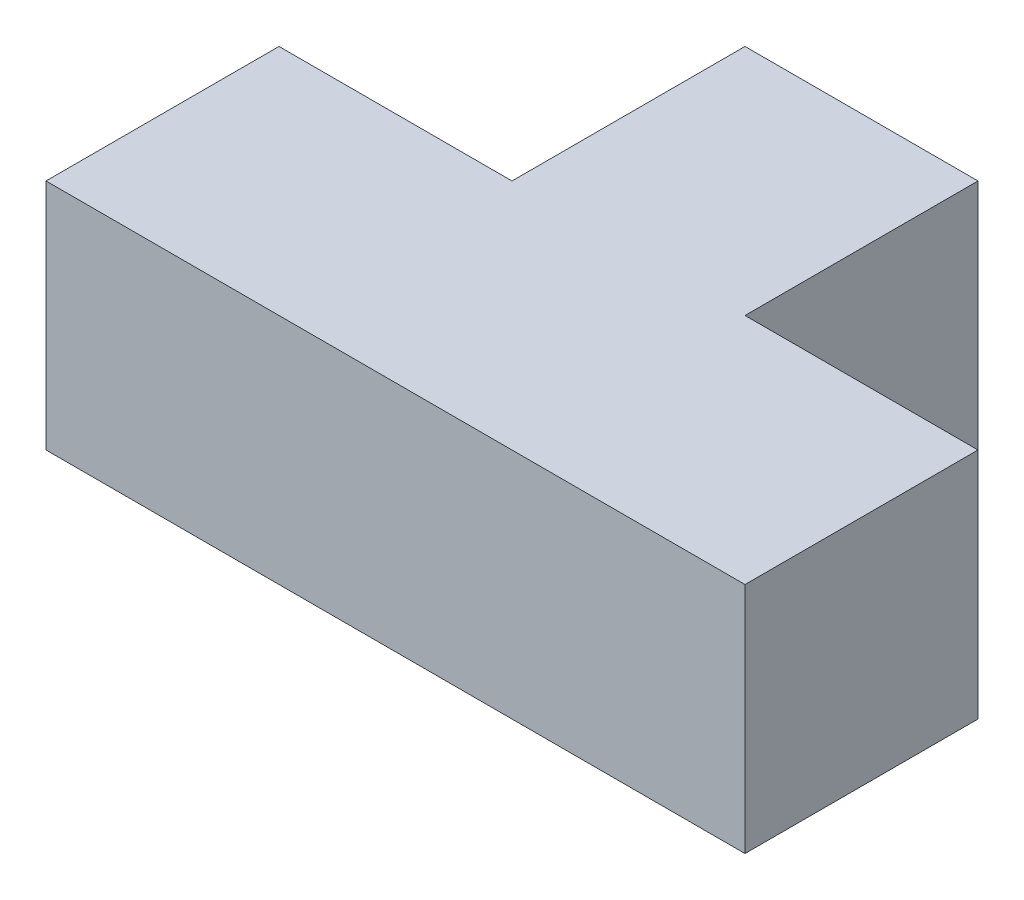
ISO-10303-21;
HEADER;
FILE_DESCRIPTION(('STEP AP214'),'2;1');
FILE_NAME('part.step','',(''),(''),'','','');
FILE_SCHEMA(('AUTOMOTIVE_DESIGN { 1 0 10303 214 1 1 1 1 }'));
ENDSEC;
DATA;
#1=APPLICATION_CONTEXT('core data for automotive mechanical design processes');
#2=APPLICATION_PROTOCOL_DEFINITION('international standard','automotive_design',2000,#1);
#3=PRODUCT_CONTEXT('',#1,'mechanical');
#4=PRODUCT('Part','Part','',(#3));
#5=PRODUCT_RELATED_PRODUCT_CATEGORY('part','',(#4));
#6=PRODUCT_DEFINITION_FORMATION('','',#4);
#7=PRODUCT_DEFINITION_CONTEXT('part definition',#1,'design');
#8=PRODUCT_DEFINITION('design','',#6,#7);
#9=PRODUCT_DEFINITION_SHAPE('','',#8);
#10=(LENGTH_UNIT() NAMED_UNIT(*) SI_UNIT(.MILLI.,.METRE.));
#11=(NAMED_UNIT(*) PLANE_ANGLE_UNIT() SI_UNIT($,.RADIAN.));
#12=(NAMED_UNIT(*) SI_UNIT($,.STERADIAN.) SOLID_ANGLE_UNIT());
#13=UNCERTAINTY_MEASURE_WITH_UNIT(LENGTH_MEASURE(1.E-05),#10,'distance_accuracy_value','');
#14=(GEOMETRIC_REPRESENTATION_CONTEXT(3) GLOBAL_UNCERTAINTY_ASSIGNED_CONTEXT((#13)) GLOBAL_UNIT_ASSIGNED_CONTEXT((#10,
#11,#12)) REPRESENTATION_CONTEXT('',''));
#15=CARTESIAN_POINT('',(0.,0.,0.));
#16=DIRECTION('',(0.,0.,1.));
#17=DIRECTION('',(1.,0.,0.));
#18=AXIS2_PLACEMENT_3D('',#15,#16,#17);
#19=CARTESIAN_POINT('',(0.,100.,-200.));
#20=DIRECTION('',(1.,0.,0.));
#21=DIRECTION('',(0.,0.,-1.));
#22=AXIS2_PLACEMENT_3D('',#19,#20,#21);
#23=PLANE('',#22);
#24=DIRECTION('',(0.,-1.,0.));
#25=VECTOR('',#24,1.);
#26=CARTESIAN_POINT('',(0.,100.,-100.));
#27=LINE('',#26,#25);
#28=CARTESIAN_POINT('',(0.,100.,-100.));
#29=VERTEX_POINT('',#28);
#30=CARTESIAN_POINT('',(0.,0.,-100.));
#31=VERTEX_POINT('',#30);
#32=EDGE_CURVE('E54',#29,#31,#27,.T.);
#33=ORIENTED_EDGE('',*,*,#32,.F.);
#34=DIRECTION('',(0.,0.,1.));
#35=VECTOR('',#34,1.);
#36=CARTESIAN_POINT('',(0.,100.,-200.));
#37=LINE('',#36,#35);
#38=CARTESIAN_POINT('',(0.,100.,-200.));
#39=VERTEX_POINT('',#38);
#40=EDGE_CURVE('E116',#39,#29,#37,.T.);
#41=ORIENTED_EDGE('',*,*,#40,.F.);
#42=DIRECTION('',(0.,-1.,0.));
#43=VECTOR('',#42,1.);
#44=CARTESIAN_POINT('',(0.,100.,-200.));
#45=LINE('',#44,#43);
#46=CARTESIAN_POINT('',(0.,0.,-200.));
#47=VERTEX_POINT('',#46);
#48=EDGE_CURVE('E47',#39,#47,#45,.T.);
#49=ORIENTED_EDGE('',*,*,#48,.T.);
#50=DIRECTION('',(0.,0.,1.));
#51=VECTOR('',#50,1.);
#52=CARTESIAN_POINT('',(0.,0.,-200.));
#53=LINE('',#52,#51);
#54=EDGE_CURVE('E139',#47,#31,#53,.T.);
#55=ORIENTED_EDGE('',*,*,#54,.T.);
#56=EDGE_LOOP('',(#33,#41,#49,#55));
#57=FACE_BOUND('',#56,.T.);
#58=ADVANCED_FACE('F39',(#57),#23,.F.);
#59=CARTESIAN_POINT('',(100.,100.,-100.));
#60=DIRECTION('',(-1.,0.,0.));
#61=DIRECTION('',(0.,0.,1.));
#62=AXIS2_PLACEMENT_3D('',#59,#60,#61);
#63=PLANE('',#62);
#64=DIRECTION('',(0.,0.,-1.));
#65=VECTOR('',#64,1.);
#66=CARTESIAN_POINT('',(100.,0.,-100.));
#67=LINE('',#66,#65);
#68=CARTESIAN_POINT('',(100.,0.,-100.));
#69=VERTEX_POINT('',#68);
#70=CARTESIAN_POINT('',(100.,0.,-200.));
#71=VERTEX_POINT('',#70);
#72=EDGE_CURVE('E133',#69,#71,#67,.T.);
#73=ORIENTED_EDGE('',*,*,#72,.T.);
#74=DIRECTION('',(0.,-1.,0.));
#75=VECTOR('',#74,1.);
#76=CARTESIAN_POINT('',(100.,100.,-200.));
#77=LINE('',#76,#75);
#78=CARTESIAN_POINT('',(100.,100.,-200.));
#79=VERTEX_POINT('',#78);
#80=EDGE_CURVE('E11',#79,#71,#77,.T.);
#81=ORIENTED_EDGE('',*,*,#80,.F.);
#82=DIRECTION('',(0.,0.,-1.));
#83=VECTOR('',#82,1.);
#84=CARTESIAN_POINT('',(100.,100.,-100.));
#85=LINE('',#84,#83);
#86=CARTESIAN_POINT('',(100.,100.,-100.));
#87=VERTEX_POINT('',#86);
#88=EDGE_CURVE('E145',#87,#79,#85,.T.);
#89=ORIENTED_EDGE('',*,*,#88,.F.);
#90=DIRECTION('',(0.,-1.,0.));
#91=VECTOR('',#90,1.);
#92=CARTESIAN_POINT('',(100.,100.,-100.));
#93=LINE('',#92,#91);
#94=EDGE_CURVE('E129',#87,#69,#93,.T.);
#95=ORIENTED_EDGE('',*,*,#94,.T.);
#96=EDGE_LOOP('',(#73,#81,#89,#95));
#97=FACE_BOUND('',#96,.T.);
#98=ADVANCED_FACE('F41',(#97),#63,.F.);
#99=CARTESIAN_POINT('',(100.,100.,-200.));
#100=DIRECTION('',(0.,0.,1.));
#101=DIRECTION('',(1.,0.,0.));
#102=AXIS2_PLACEMENT_3D('',#99,#100,#101);
#103=PLANE('',#102);
#104=DIRECTION('',(-1.,0.,0.));
#105=VECTOR('',#104,1.);
#106=CARTESIAN_POINT('',(100.,0.,-200.));
#107=LINE('',#106,#105);
#108=EDGE_CURVE('E136',#71,#47,#107,.T.);
#109=ORIENTED_EDGE('',*,*,#108,.T.);
#110=ORIENTED_EDGE('',*,*,#48,.F.);
#111=DIRECTION('',(-1.,0.,0.));
#112=VECTOR('',#111,1.);
#113=CARTESIAN_POINT('',(100.,100.,-200.));
#114=LINE('',#113,#112);
#115=EDGE_CURVE('E95',#79,#39,#114,.T.);
#116=ORIENTED_EDGE('',*,*,#115,.F.);
#117=ORIENTED_EDGE('',*,*,#80,.T.);
#118=EDGE_LOOP('',(#109,#110,#116,#117));
#119=FACE_BOUND('',#118,.T.);
#120=ADVANCED_FACE('F185',(#119),#103,.F.);
#121=CARTESIAN_POINT('',(0.,100.,0.));
#122=DIRECTION('',(0.,0.,-1.));
#123=DIRECTION('',(-1.,0.,0.));
#124=AXIS2_PLACEMENT_3D('',#121,#122,#123);
#125=PLANE('',#124);
#126=DIRECTION('',(1.,0.,0.));
#127=VECTOR('',#126,1.);
#128=CARTESIAN_POINT('',(0.,0.,0.));
#129=LINE('',#128,#127);
#130=CARTESIAN_POINT('',(-100.,0.,0.));
#131=VERTEX_POINT('',#130);
#132=CARTESIAN_POINT('',(200.,0.,0.));
#133=VERTEX_POINT('',#132);
#134=EDGE_CURVE('E122',#131,#133,#129,.T.);
#135=ORIENTED_EDGE('',*,*,#134,.T.);
#136=DIRECTION('',(0.,-1.,0.));
#137=VECTOR('',#136,1.);
#138=CARTESIAN_POINT('',(200.,100.,0.));
#139=LINE('',#138,#137);
#140=CARTESIAN_POINT('',(200.,100.,0.));
#141=VERTEX_POINT('',#140);
#142=EDGE_CURVE('E119',#141,#133,#139,.T.);
#143=ORIENTED_EDGE('',*,*,#142,.F.);
#144=DIRECTION('',(1.,0.,0.));
#145=VECTOR('',#144,1.);
#146=CARTESIAN_POINT('',(0.,100.,0.));
#147=LINE('',#146,#145);
#148=CARTESIAN_POINT('',(-100.,100.,0.));
#149=VERTEX_POINT('',#148);
#150=EDGE_CURVE('E103',#149,#141,#147,.T.);
#151=ORIENTED_EDGE('',*,*,#150,.F.);
#152=DIRECTION('',(0.,1.,0.));
#153=VECTOR('',#152,1.);
#154=CARTESIAN_POINT('',(-100.,0.,0.));
#155=LINE('',#154,#153);
#156=EDGE_CURVE('E175',#131,#149,#155,.T.);
#157=ORIENTED_EDGE('',*,*,#156,.F.);
#158=EDGE_LOOP('',(#135,#143,#151,#157));
#159=FACE_BOUND('',#158,.T.);
#160=ADVANCED_FACE('F120',(#159),#125,.F.);
#161=CARTESIAN_POINT('',(200.,100.,0.));
#162=DIRECTION('',(-1.,0.,0.));
#163=DIRECTION('',(0.,0.,1.));
#164=AXIS2_PLACEMENT_3D('',#161,#162,#163);
#165=PLANE('',#164);
#166=DIRECTION('',(0.,0.,-1.));
#167=VECTOR('',#166,1.);
#168=CARTESIAN_POINT('',(200.,0.,0.));
#169=LINE('',#168,#167);
#170=CARTESIAN_POINT('',(200.,0.,-100.));
#171=VERTEX_POINT('',#170);
#172=EDGE_CURVE('E142',#133,#171,#169,.T.);
#173=ORIENTED_EDGE('',*,*,#172,.T.);
#174=DIRECTION('',(0.,-1.,0.));
#175=VECTOR('',#174,1.);
#176=CARTESIAN_POINT('',(200.,100.,-100.));
#177=LINE('',#176,#175);
#178=CARTESIAN_POINT('',(200.,100.,-100.));
#179=VERTEX_POINT('',#178);
#180=EDGE_CURVE('E125',#179,#171,#177,.T.);
#181=ORIENTED_EDGE('',*,*,#180,.F.);
#182=DIRECTION('',(0.,0.,-1.));
#183=VECTOR('',#182,1.);
#184=CARTESIAN_POINT('',(200.,100.,0.));
#185=LINE('',#184,#183);
#186=EDGE_CURVE('E107',#141,#179,#185,.T.);
#187=ORIENTED_EDGE('',*,*,#186,.F.);
#188=ORIENTED_EDGE('',*,*,#142,.T.);
#189=EDGE_LOOP('',(#173,#181,#187,#188));
#190=FACE_BOUND('',#189,.T.);
#191=ADVANCED_FACE('F127',(#190),#165,.F.);
#192=CARTESIAN_POINT('',(200.,100.,-100.));
#193=DIRECTION('',(0.,0.,1.));
#194=DIRECTION('',(1.,0.,0.));
#195=AXIS2_PLACEMENT_3D('',#192,#193,#194);
#196=PLANE('',#195);
#197=DIRECTION('',(-1.,0.,0.));
#198=VECTOR('',#197,1.);
#199=CARTESIAN_POINT('',(200.,0.,-100.));
#200=LINE('',#199,#198);
#201=EDGE_CURVE('E87',#171,#69,#200,.T.);
#202=ORIENTED_EDGE('',*,*,#201,.T.);
#203=ORIENTED_EDGE('',*,*,#94,.F.);
#204=DIRECTION('',(-1.,0.,0.));
#205=VECTOR('',#204,1.);
#206=CARTESIAN_POINT('',(200.,100.,-100.));
#207=LINE('',#206,#205);
#208=EDGE_CURVE('E63',#179,#87,#207,.T.);
#209=ORIENTED_EDGE('',*,*,#208,.F.);
#210=ORIENTED_EDGE('',*,*,#180,.T.);
#211=EDGE_LOOP('',(#202,#203,#209,#210));
#212=FACE_BOUND('',#211,.T.);
#213=ADVANCED_FACE('F181',(#212),#196,.F.);
#214=CARTESIAN_POINT('',(0.,100.,0.));
#215=DIRECTION('',(0.,1.,0.));
#216=DIRECTION('',(0.,0.,1.));
#217=AXIS2_PLACEMENT_3D('',#214,#215,#216);
#218=PLANE('',#217);
#219=ORIENTED_EDGE('',*,*,#88,.T.);
#220=ORIENTED_EDGE('',*,*,#115,.T.);
#221=ORIENTED_EDGE('',*,*,#40,.T.);
#222=DIRECTION('',(1.,0.,0.));
#223=VECTOR('',#222,1.);
#224=CARTESIAN_POINT('',(-100.,100.,-100.));
#225=LINE('',#224,#223);
#226=CARTESIAN_POINT('',(-100.,100.,-100.));
#227=VERTEX_POINT('',#226);
#228=EDGE_CURVE('E137',#227,#29,#225,.T.);
#229=ORIENTED_EDGE('',*,*,#228,.F.);
#230=DIRECTION('',(0.,0.,-1.));
#231=VECTOR('',#230,1.);
#232=CARTESIAN_POINT('',(-100.,100.,0.));
#233=LINE('',#232,#231);
#234=EDGE_CURVE('E112',#149,#227,#233,.T.);
#235=ORIENTED_EDGE('',*,*,#234,.F.);
#236=ORIENTED_EDGE('',*,*,#150,.T.);
#237=ORIENTED_EDGE('',*,*,#186,.T.);
#238=ORIENTED_EDGE('',*,*,#208,.T.);
#239=EDGE_LOOP('',(#219,#220,#221,#229,#235,#236,#237,#238));
#240=FACE_BOUND('',#239,.T.);
#241=ADVANCED_FACE('F105',(#240),#218,.T.);
#242=CARTESIAN_POINT('',(0.,0.,0.));
#243=DIRECTION('',(0.,1.,0.));
#244=DIRECTION('',(0.,0.,1.));
#245=AXIS2_PLACEMENT_3D('',#242,#243,#244);
#246=PLANE('',#245);
#247=ORIENTED_EDGE('',*,*,#72,.F.);
#248=ORIENTED_EDGE('',*,*,#201,.F.);
#249=ORIENTED_EDGE('',*,*,#172,.F.);
#250=ORIENTED_EDGE('',*,*,#134,.F.);
#251=DIRECTION('',(0.,0.,1.));
#252=VECTOR('',#251,1.);
#253=CARTESIAN_POINT('',(-100.,0.,-100.));
#254=LINE('',#253,#252);
#255=CARTESIAN_POINT('',(-100.,0.,-100.));
#256=VERTEX_POINT('',#255);
#257=EDGE_CURVE('E158',#256,#131,#254,.T.);
#258=ORIENTED_EDGE('',*,*,#257,.F.);
#259=DIRECTION('',(1.,0.,0.));
#260=VECTOR('',#259,1.);
#261=CARTESIAN_POINT('',(-100.,0.,-100.));
#262=LINE('',#261,#260);
#263=EDGE_CURVE('E155',#256,#31,#262,.T.);
#264=ORIENTED_EDGE('',*,*,#263,.T.);
#265=ORIENTED_EDGE('',*,*,#54,.F.);
#266=ORIENTED_EDGE('',*,*,#108,.F.);
#267=EDGE_LOOP('',(#247,#248,#249,#250,#258,#264,#265,#266));
#268=FACE_BOUND('',#267,.T.);
#269=ADVANCED_FACE('F152',(#268),#246,.F.);
#270=CARTESIAN_POINT('',(-100.,100.,-100.));
#271=DIRECTION('',(0.,0.,1.));
#272=DIRECTION('',(1.,0.,0.));
#273=AXIS2_PLACEMENT_3D('',#270,#271,#272);
#274=PLANE('',#273);
#275=ORIENTED_EDGE('',*,*,#32,.T.);
#276=ORIENTED_EDGE('',*,*,#263,.F.);
#277=DIRECTION('',(0.,-1.,0.));
#278=VECTOR('',#277,1.);
#279=CARTESIAN_POINT('',(-100.,100.,-100.));
#280=LINE('',#279,#278);
#281=EDGE_CURVE('E164',#227,#256,#280,.T.);
#282=ORIENTED_EDGE('',*,*,#281,.F.);
#283=ORIENTED_EDGE('',*,*,#228,.T.);
#284=EDGE_LOOP('',(#275,#276,#282,#283));
#285=FACE_BOUND('',#284,.T.);
#286=ADVANCED_FACE('F170',(#285),#274,.F.);
#287=CARTESIAN_POINT('',(-100.,0.,0.));
#288=DIRECTION('',(-1.,0.,0.));
#289=DIRECTION('',(0.,0.,1.));
#290=AXIS2_PLACEMENT_3D('',#287,#288,#289);
#291=PLANE('',#290);
#292=ORIENTED_EDGE('',*,*,#156,.T.);
#293=ORIENTED_EDGE('',*,*,#234,.T.);
#294=ORIENTED_EDGE('',*,*,#281,.T.);
#295=ORIENTED_EDGE('',*,*,#257,.T.);
#296=EDGE_LOOP('',(#292,#293,#294,#295));
#297=FACE_BOUND('',#296,.T.);
#298=ADVANCED_FACE('F178',(#297),#291,.T.);
#299=CLOSED_SHELL('',(#58,#98,#120,#160,#191,#213,#241,#269,#286,#298));
#300=MANIFOLD_SOLID_BREP('B2',#299);
#301=ADVANCED_BREP_SHAPE_REPRESENTATION('',(#18,#300),#14);
#302=SHAPE_DEFINITION_REPRESENTATION(#9,#301);
ENDSEC;
END-ISO-10303-21;
